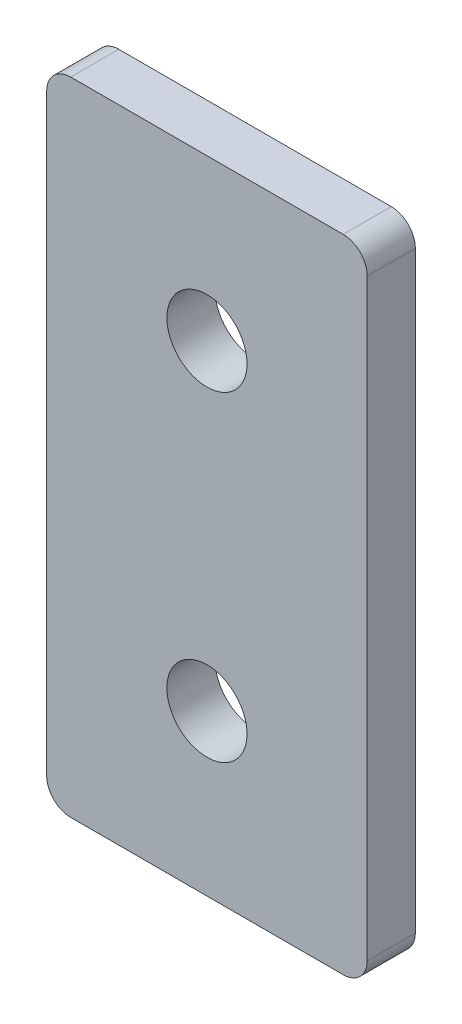
ISO-10303-21;
HEADER;
FILE_DESCRIPTION(('STEP AP214'),'2;1');
FILE_NAME('part.step','',(''),(''),'','','');
FILE_SCHEMA(('AUTOMOTIVE_DESIGN { 1 0 10303 214 1 1 1 1 }'));
ENDSEC;
DATA;
#1=APPLICATION_CONTEXT('core data for automotive mechanical design processes');
#2=APPLICATION_PROTOCOL_DEFINITION('international standard','automotive_design',2000,#1);
#3=PRODUCT_CONTEXT('',#1,'mechanical');
#4=PRODUCT('Part','Part','',(#3));
#5=PRODUCT_RELATED_PRODUCT_CATEGORY('part','',(#4));
#6=PRODUCT_DEFINITION_FORMATION('','',#4);
#7=PRODUCT_DEFINITION_CONTEXT('part definition',#1,'design');
#8=PRODUCT_DEFINITION('design','',#6,#7);
#9=PRODUCT_DEFINITION_SHAPE('','',#8);
#10=(LENGTH_UNIT() NAMED_UNIT(*) SI_UNIT(.MILLI.,.METRE.));
#11=(NAMED_UNIT(*) PLANE_ANGLE_UNIT() SI_UNIT($,.RADIAN.));
#12=(NAMED_UNIT(*) SI_UNIT($,.STERADIAN.) SOLID_ANGLE_UNIT());
#13=UNCERTAINTY_MEASURE_WITH_UNIT(LENGTH_MEASURE(1.E-05),#10,'distance_accuracy_value','');
#14=(GEOMETRIC_REPRESENTATION_CONTEXT(3) GLOBAL_UNCERTAINTY_ASSIGNED_CONTEXT((#13)) GLOBAL_UNIT_ASSIGNED_CONTEXT((#10,
#11,#12)) REPRESENTATION_CONTEXT('',''));
#15=CARTESIAN_POINT('',(0.,0.,0.));
#16=DIRECTION('',(0.,0.,1.));
#17=DIRECTION('',(1.,0.,0.));
#18=AXIS2_PLACEMENT_3D('',#15,#16,#17);
#19=CARTESIAN_POINT('',(-8.50000000000001,1.5,3.));
#20=DIRECTION('',(0.,0.,1.));
#21=DIRECTION('',(1.,0.,0.));
#22=AXIS2_PLACEMENT_3D('',#19,#20,#21);
#23=PLANE('',#22);
#24=CARTESIAN_POINT('',(0.,30.,3.));
#25=DIRECTION('',(0.,0.,1.));
#26=DIRECTION('',(1.,0.,0.));
#27=AXIS2_PLACEMENT_3D('',#24,#25,#26);
#28=CIRCLE('',#27,2.5);
#29=CARTESIAN_POINT('',(2.5,30.,3.));
#30=VERTEX_POINT('',#29);
#31=EDGE_CURVE('E133',#30,#30,#28,.T.);
#32=ORIENTED_EDGE('',*,*,#31,.F.);
#33=EDGE_LOOP('',(#32));
#34=FACE_BOUND('',#33,.T.);
#35=CARTESIAN_POINT('',(-8.50000000000001,1.5,3.));
#36=DIRECTION('',(0.,0.,1.));
#37=DIRECTION('',(1.,0.,0.));
#38=AXIS2_PLACEMENT_3D('',#35,#36,#37);
#39=CIRCLE('',#38,1.5);
#40=CARTESIAN_POINT('',(-10.,1.5,3.));
#41=VERTEX_POINT('',#40);
#42=CARTESIAN_POINT('',(-8.50000000000001,0.,3.));
#43=VERTEX_POINT('',#42);
#44=EDGE_CURVE('E144',#41,#43,#39,.T.);
#45=ORIENTED_EDGE('',*,*,#44,.T.);
#46=DIRECTION('',(1.,0.,0.));
#47=VECTOR('',#46,1.);
#48=CARTESIAN_POINT('',(8.50000000000001,0.,3.));
#49=LINE('',#48,#47);
#50=CARTESIAN_POINT('',(8.50000000000001,0.,3.));
#51=VERTEX_POINT('',#50);
#52=EDGE_CURVE('E92',#43,#51,#49,.T.);
#53=ORIENTED_EDGE('',*,*,#52,.T.);
#54=CARTESIAN_POINT('',(8.50000000000001,1.5,3.));
#55=DIRECTION('',(0.,0.,1.));
#56=DIRECTION('',(1.,0.,0.));
#57=AXIS2_PLACEMENT_3D('',#54,#55,#56);
#58=CIRCLE('',#57,1.49999999999999);
#59=CARTESIAN_POINT('',(9.99999999999998,1.5,3.));
#60=VERTEX_POINT('',#59);
#61=EDGE_CURVE('E159',#51,#60,#58,.T.);
#62=ORIENTED_EDGE('',*,*,#61,.T.);
#63=DIRECTION('',(0.,1.,0.));
#64=VECTOR('',#63,1.);
#65=CARTESIAN_POINT('',(9.99999999999998,38.5,3.));
#66=LINE('',#65,#64);
#67=CARTESIAN_POINT('',(9.99999999999999,38.5,3.));
#68=VERTEX_POINT('',#67);
#69=EDGE_CURVE('E172',#60,#68,#66,.T.);
#70=ORIENTED_EDGE('',*,*,#69,.T.);
#71=CARTESIAN_POINT('',(8.50000000000001,38.5,3.));
#72=DIRECTION('',(0.,0.,1.));
#73=DIRECTION('',(1.,0.,0.));
#74=AXIS2_PLACEMENT_3D('',#71,#72,#73);
#75=CIRCLE('',#74,1.49999999999999);
#76=CARTESIAN_POINT('',(8.50000000000001,40.,3.));
#77=VERTEX_POINT('',#76);
#78=EDGE_CURVE('E111',#68,#77,#75,.T.);
#79=ORIENTED_EDGE('',*,*,#78,.T.);
#80=DIRECTION('',(-1.,0.,0.));
#81=VECTOR('',#80,1.);
#82=CARTESIAN_POINT('',(-8.50000000000001,40.,3.));
#83=LINE('',#82,#81);
#84=CARTESIAN_POINT('',(-8.50000000000001,40.,3.));
#85=VERTEX_POINT('',#84);
#86=EDGE_CURVE('E105',#77,#85,#83,.T.);
#87=ORIENTED_EDGE('',*,*,#86,.T.);
#88=CARTESIAN_POINT('',(-8.50000000000001,38.5,3.));
#89=DIRECTION('',(0.,0.,1.));
#90=DIRECTION('',(1.,0.,0.));
#91=AXIS2_PLACEMENT_3D('',#88,#89,#90);
#92=CIRCLE('',#91,1.5);
#93=CARTESIAN_POINT('',(-10.,38.5,3.));
#94=VERTEX_POINT('',#93);
#95=EDGE_CURVE('E109',#85,#94,#92,.T.);
#96=ORIENTED_EDGE('',*,*,#95,.T.);
#97=DIRECTION('',(0.,-1.,0.));
#98=VECTOR('',#97,1.);
#99=CARTESIAN_POINT('',(-10.,1.5,3.));
#100=LINE('',#99,#98);
#101=EDGE_CURVE('E49',#94,#41,#100,.T.);
#102=ORIENTED_EDGE('',*,*,#101,.T.);
#103=EDGE_LOOP('',(#45,#53,#62,#70,#79,#87,#96,#102));
#104=FACE_BOUND('',#103,.T.);
#105=CARTESIAN_POINT('',(0.,10.,3.));
#106=DIRECTION('',(0.,0.,1.));
#107=DIRECTION('',(-1.,0.,0.));
#108=AXIS2_PLACEMENT_3D('',#105,#106,#107);
#109=CIRCLE('',#108,2.5);
#110=CARTESIAN_POINT('',(-2.5,10.,3.));
#111=VERTEX_POINT('',#110);
#112=EDGE_CURVE('E181',#111,#111,#109,.T.);
#113=ORIENTED_EDGE('',*,*,#112,.F.);
#114=EDGE_LOOP('',(#113));
#115=FACE_BOUND('',#114,.T.);
#116=ADVANCED_FACE('F32',(#34,#104,#115),#23,.T.);
#117=CARTESIAN_POINT('',(-8.50000000000001,1.5,0.));
#118=DIRECTION('',(0.,0.,1.));
#119=DIRECTION('',(1.,0.,0.));
#120=AXIS2_PLACEMENT_3D('',#117,#118,#119);
#121=PLANE('',#120);
#122=CARTESIAN_POINT('',(-8.50000000000001,1.5,0.));
#123=DIRECTION('',(0.,0.,1.));
#124=DIRECTION('',(1.,0.,0.));
#125=AXIS2_PLACEMENT_3D('',#122,#123,#124);
#126=CIRCLE('',#125,1.5);
#127=CARTESIAN_POINT('',(-10.,1.5,0.));
#128=VERTEX_POINT('',#127);
#129=CARTESIAN_POINT('',(-8.50000000000001,0.,0.));
#130=VERTEX_POINT('',#129);
#131=EDGE_CURVE('E129',#128,#130,#126,.T.);
#132=ORIENTED_EDGE('',*,*,#131,.F.);
#133=DIRECTION('',(0.,-1.,0.));
#134=VECTOR('',#133,1.);
#135=CARTESIAN_POINT('',(-10.,1.5,0.));
#136=LINE('',#135,#134);
#137=CARTESIAN_POINT('',(-10.,38.5,0.));
#138=VERTEX_POINT('',#137);
#139=EDGE_CURVE('E84',#138,#128,#136,.T.);
#140=ORIENTED_EDGE('',*,*,#139,.F.);
#141=CARTESIAN_POINT('',(-8.50000000000001,38.5,0.));
#142=DIRECTION('',(0.,0.,1.));
#143=DIRECTION('',(1.,0.,0.));
#144=AXIS2_PLACEMENT_3D('',#141,#142,#143);
#145=CIRCLE('',#144,1.5);
#146=CARTESIAN_POINT('',(-8.50000000000001,40.,0.));
#147=VERTEX_POINT('',#146);
#148=EDGE_CURVE('E78',#147,#138,#145,.T.);
#149=ORIENTED_EDGE('',*,*,#148,.F.);
#150=DIRECTION('',(-1.,0.,0.));
#151=VECTOR('',#150,1.);
#152=CARTESIAN_POINT('',(-8.50000000000001,40.,0.));
#153=LINE('',#152,#151);
#154=CARTESIAN_POINT('',(8.50000000000001,40.,0.));
#155=VERTEX_POINT('',#154);
#156=EDGE_CURVE('E119',#155,#147,#153,.T.);
#157=ORIENTED_EDGE('',*,*,#156,.F.);
#158=CARTESIAN_POINT('',(8.50000000000001,38.5,0.));
#159=DIRECTION('',(0.,0.,1.));
#160=DIRECTION('',(1.,0.,0.));
#161=AXIS2_PLACEMENT_3D('',#158,#159,#160);
#162=CIRCLE('',#161,1.49999999999999);
#163=CARTESIAN_POINT('',(9.99999999999999,38.5,0.));
#164=VERTEX_POINT('',#163);
#165=EDGE_CURVE('E139',#164,#155,#162,.T.);
#166=ORIENTED_EDGE('',*,*,#165,.F.);
#167=DIRECTION('',(0.,1.,0.));
#168=VECTOR('',#167,1.);
#169=CARTESIAN_POINT('',(9.99999999999998,38.5,0.));
#170=LINE('',#169,#168);
#171=CARTESIAN_POINT('',(9.99999999999998,1.5,0.));
#172=VERTEX_POINT('',#171);
#173=EDGE_CURVE('E137',#172,#164,#170,.T.);
#174=ORIENTED_EDGE('',*,*,#173,.F.);
#175=CARTESIAN_POINT('',(8.50000000000001,1.5,0.));
#176=DIRECTION('',(0.,0.,1.));
#177=DIRECTION('',(1.,0.,0.));
#178=AXIS2_PLACEMENT_3D('',#175,#176,#177);
#179=CIRCLE('',#178,1.49999999999999);
#180=CARTESIAN_POINT('',(8.50000000000001,0.,0.));
#181=VERTEX_POINT('',#180);
#182=EDGE_CURVE('E135',#181,#172,#179,.T.);
#183=ORIENTED_EDGE('',*,*,#182,.F.);
#184=DIRECTION('',(1.,0.,0.));
#185=VECTOR('',#184,1.);
#186=CARTESIAN_POINT('',(8.50000000000001,0.,0.));
#187=LINE('',#186,#185);
#188=EDGE_CURVE('E132',#130,#181,#187,.T.);
#189=ORIENTED_EDGE('',*,*,#188,.F.);
#190=EDGE_LOOP('',(#132,#140,#149,#157,#166,#174,#183,#189));
#191=FACE_BOUND('',#190,.T.);
#192=CARTESIAN_POINT('',(0.,30.,0.));
#193=DIRECTION('',(0.,0.,1.));
#194=DIRECTION('',(1.,0.,0.));
#195=AXIS2_PLACEMENT_3D('',#192,#193,#194);
#196=CIRCLE('',#195,2.5);
#197=CARTESIAN_POINT('',(2.5,30.,0.));
#198=VERTEX_POINT('',#197);
#199=EDGE_CURVE('E178',#198,#198,#196,.T.);
#200=ORIENTED_EDGE('',*,*,#199,.T.);
#201=EDGE_LOOP('',(#200));
#202=FACE_BOUND('',#201,.T.);
#203=CARTESIAN_POINT('',(0.,10.,0.));
#204=DIRECTION('',(0.,0.,1.));
#205=DIRECTION('',(-1.,0.,0.));
#206=AXIS2_PLACEMENT_3D('',#203,#204,#205);
#207=CIRCLE('',#206,2.5);
#208=CARTESIAN_POINT('',(-2.5,10.,0.));
#209=VERTEX_POINT('',#208);
#210=EDGE_CURVE('E184',#209,#209,#207,.T.);
#211=ORIENTED_EDGE('',*,*,#210,.T.);
#212=EDGE_LOOP('',(#211));
#213=FACE_BOUND('',#212,.T.);
#214=ADVANCED_FACE('F163',(#191,#202,#213),#121,.F.);
#215=CARTESIAN_POINT('',(-8.50000000000001,1.5,3.));
#216=DIRECTION('',(0.,0.,-1.));
#217=DIRECTION('',(-1.,0.,0.));
#218=AXIS2_PLACEMENT_3D('',#215,#216,#217);
#219=CYLINDRICAL_SURFACE('',#218,1.5);
#220=ORIENTED_EDGE('',*,*,#131,.T.);
#221=DIRECTION('',(0.,0.,-1.));
#222=VECTOR('',#221,1.);
#223=CARTESIAN_POINT('',(-8.50000000000001,0.,3.));
#224=LINE('',#223,#222);
#225=EDGE_CURVE('E11',#43,#130,#224,.T.);
#226=ORIENTED_EDGE('',*,*,#225,.F.);
#227=ORIENTED_EDGE('',*,*,#44,.F.);
#228=DIRECTION('',(0.,0.,-1.));
#229=VECTOR('',#228,1.);
#230=CARTESIAN_POINT('',(-10.,1.5,3.));
#231=LINE('',#230,#229);
#232=EDGE_CURVE('E125',#41,#128,#231,.T.);
#233=ORIENTED_EDGE('',*,*,#232,.T.);
#234=EDGE_LOOP('',(#220,#226,#227,#233));
#235=FACE_BOUND('',#234,.T.);
#236=ADVANCED_FACE('F34',(#235),#219,.T.);
#237=CARTESIAN_POINT('',(8.50000000000001,0.,3.));
#238=DIRECTION('',(0.,1.,0.));
#239=DIRECTION('',(0.,0.,1.));
#240=AXIS2_PLACEMENT_3D('',#237,#238,#239);
#241=PLANE('',#240);
#242=ORIENTED_EDGE('',*,*,#188,.T.);
#243=DIRECTION('',(0.,0.,-1.));
#244=VECTOR('',#243,1.);
#245=CARTESIAN_POINT('',(8.50000000000001,0.,3.));
#246=LINE('',#245,#244);
#247=EDGE_CURVE('E41',#51,#181,#246,.T.);
#248=ORIENTED_EDGE('',*,*,#247,.F.);
#249=ORIENTED_EDGE('',*,*,#52,.F.);
#250=ORIENTED_EDGE('',*,*,#225,.T.);
#251=EDGE_LOOP('',(#242,#248,#249,#250));
#252=FACE_BOUND('',#251,.T.);
#253=ADVANCED_FACE('F216',(#252),#241,.F.);
#254=CARTESIAN_POINT('',(8.50000000000001,1.5,3.));
#255=DIRECTION('',(0.,0.,-1.));
#256=DIRECTION('',(-1.,0.,0.));
#257=AXIS2_PLACEMENT_3D('',#254,#255,#256);
#258=CYLINDRICAL_SURFACE('',#257,1.49999999999999);
#259=ORIENTED_EDGE('',*,*,#182,.T.);
#260=DIRECTION('',(0.,0.,-1.));
#261=VECTOR('',#260,1.);
#262=CARTESIAN_POINT('',(9.99999999999998,1.5,3.));
#263=LINE('',#262,#261);
#264=EDGE_CURVE('E151',#60,#172,#263,.T.);
#265=ORIENTED_EDGE('',*,*,#264,.F.);
#266=ORIENTED_EDGE('',*,*,#61,.F.);
#267=ORIENTED_EDGE('',*,*,#247,.T.);
#268=EDGE_LOOP('',(#259,#265,#266,#267));
#269=FACE_BOUND('',#268,.T.);
#270=ADVANCED_FACE('F157',(#269),#258,.T.);
#271=CARTESIAN_POINT('',(9.99999999999998,38.5,3.));
#272=DIRECTION('',(-1.,0.,0.));
#273=DIRECTION('',(0.,0.,1.));
#274=AXIS2_PLACEMENT_3D('',#271,#272,#273);
#275=PLANE('',#274);
#276=ORIENTED_EDGE('',*,*,#173,.T.);
#277=DIRECTION('',(0.,0.,-1.));
#278=VECTOR('',#277,1.);
#279=CARTESIAN_POINT('',(9.99999999999999,38.5,3.));
#280=LINE('',#279,#278);
#281=EDGE_CURVE('E148',#68,#164,#280,.T.);
#282=ORIENTED_EDGE('',*,*,#281,.F.);
#283=ORIENTED_EDGE('',*,*,#69,.F.);
#284=ORIENTED_EDGE('',*,*,#264,.T.);
#285=EDGE_LOOP('',(#276,#282,#283,#284));
#286=FACE_BOUND('',#285,.T.);
#287=ADVANCED_FACE('F168',(#286),#275,.F.);
#288=CARTESIAN_POINT('',(8.50000000000001,38.5,3.));
#289=DIRECTION('',(0.,0.,-1.));
#290=DIRECTION('',(-1.,0.,0.));
#291=AXIS2_PLACEMENT_3D('',#288,#289,#290);
#292=CYLINDRICAL_SURFACE('',#291,1.49999999999999);
#293=ORIENTED_EDGE('',*,*,#165,.T.);
#294=DIRECTION('',(0.,0.,-1.));
#295=VECTOR('',#294,1.);
#296=CARTESIAN_POINT('',(8.50000000000001,40.,3.));
#297=LINE('',#296,#295);
#298=EDGE_CURVE('E120',#77,#155,#297,.T.);
#299=ORIENTED_EDGE('',*,*,#298,.F.);
#300=ORIENTED_EDGE('',*,*,#78,.F.);
#301=ORIENTED_EDGE('',*,*,#281,.T.);
#302=EDGE_LOOP('',(#293,#299,#300,#301));
#303=FACE_BOUND('',#302,.T.);
#304=ADVANCED_FACE('F171',(#303),#292,.T.);
#305=CARTESIAN_POINT('',(-8.50000000000001,40.,3.));
#306=DIRECTION('',(0.,-1.,0.));
#307=DIRECTION('',(0.,0.,-1.));
#308=AXIS2_PLACEMENT_3D('',#305,#306,#307);
#309=PLANE('',#308);
#310=ORIENTED_EDGE('',*,*,#156,.T.);
#311=DIRECTION('',(0.,0.,-1.));
#312=VECTOR('',#311,1.);
#313=CARTESIAN_POINT('',(-8.50000000000001,40.,3.));
#314=LINE('',#313,#312);
#315=EDGE_CURVE('E116',#85,#147,#314,.T.);
#316=ORIENTED_EDGE('',*,*,#315,.F.);
#317=ORIENTED_EDGE('',*,*,#86,.F.);
#318=ORIENTED_EDGE('',*,*,#298,.T.);
#319=EDGE_LOOP('',(#310,#316,#317,#318));
#320=FACE_BOUND('',#319,.T.);
#321=ADVANCED_FACE('F117',(#320),#309,.F.);
#322=CARTESIAN_POINT('',(-8.50000000000001,38.5,3.));
#323=DIRECTION('',(0.,0.,-1.));
#324=DIRECTION('',(-1.,0.,0.));
#325=AXIS2_PLACEMENT_3D('',#322,#323,#324);
#326=CYLINDRICAL_SURFACE('',#325,1.5);
#327=ORIENTED_EDGE('',*,*,#148,.T.);
#328=DIRECTION('',(0.,0.,-1.));
#329=VECTOR('',#328,1.);
#330=CARTESIAN_POINT('',(-10.,38.5,3.));
#331=LINE('',#330,#329);
#332=EDGE_CURVE('E121',#94,#138,#331,.T.);
#333=ORIENTED_EDGE('',*,*,#332,.F.);
#334=ORIENTED_EDGE('',*,*,#95,.F.);
#335=ORIENTED_EDGE('',*,*,#315,.T.);
#336=EDGE_LOOP('',(#327,#333,#334,#335));
#337=FACE_BOUND('',#336,.T.);
#338=ADVANCED_FACE('F123',(#337),#326,.T.);
#339=CARTESIAN_POINT('',(-10.,1.5,3.));
#340=DIRECTION('',(1.,0.,0.));
#341=DIRECTION('',(0.,0.,-1.));
#342=AXIS2_PLACEMENT_3D('',#339,#340,#341);
#343=PLANE('',#342);
#344=ORIENTED_EDGE('',*,*,#139,.T.);
#345=ORIENTED_EDGE('',*,*,#232,.F.);
#346=ORIENTED_EDGE('',*,*,#101,.F.);
#347=ORIENTED_EDGE('',*,*,#332,.T.);
#348=EDGE_LOOP('',(#344,#345,#346,#347));
#349=FACE_BOUND('',#348,.T.);
#350=ADVANCED_FACE('F204',(#349),#343,.F.);
#351=CARTESIAN_POINT('',(0.,30.,3.));
#352=DIRECTION('',(0.,0.,-1.));
#353=DIRECTION('',(-1.,0.,0.));
#354=AXIS2_PLACEMENT_3D('',#351,#352,#353);
#355=CYLINDRICAL_SURFACE('',#354,2.5);
#356=ORIENTED_EDGE('',*,*,#31,.T.);
#357=EDGE_LOOP('',(#356));
#358=FACE_BOUND('',#357,.T.);
#359=ORIENTED_EDGE('',*,*,#199,.F.);
#360=EDGE_LOOP('',(#359));
#361=FACE_BOUND('',#360,.T.);
#362=ADVANCED_FACE('F201',(#358,#361),#355,.F.);
#363=CARTESIAN_POINT('',(0.,10.,3.));
#364=DIRECTION('',(0.,0.,-1.));
#365=DIRECTION('',(-1.,0.,0.));
#366=AXIS2_PLACEMENT_3D('',#363,#364,#365);
#367=CYLINDRICAL_SURFACE('',#366,2.5);
#368=ORIENTED_EDGE('',*,*,#112,.T.);
#369=EDGE_LOOP('',(#368));
#370=FACE_BOUND('',#369,.T.);
#371=ORIENTED_EDGE('',*,*,#210,.F.);
#372=EDGE_LOOP('',(#371));
#373=FACE_BOUND('',#372,.T.);
#374=ADVANCED_FACE('F190',(#370,#373),#367,.F.);
#375=CLOSED_SHELL('',(#116,#214,#236,#253,#270,#287,#304,#321,#338,#350,#362,#374));
#376=MANIFOLD_SOLID_BREP('B2',#375);
#377=ADVANCED_BREP_SHAPE_REPRESENTATION('',(#18,#376),#14);
#378=SHAPE_DEFINITION_REPRESENTATION(#9,#377);
ENDSEC;
END-ISO-10303-21;
